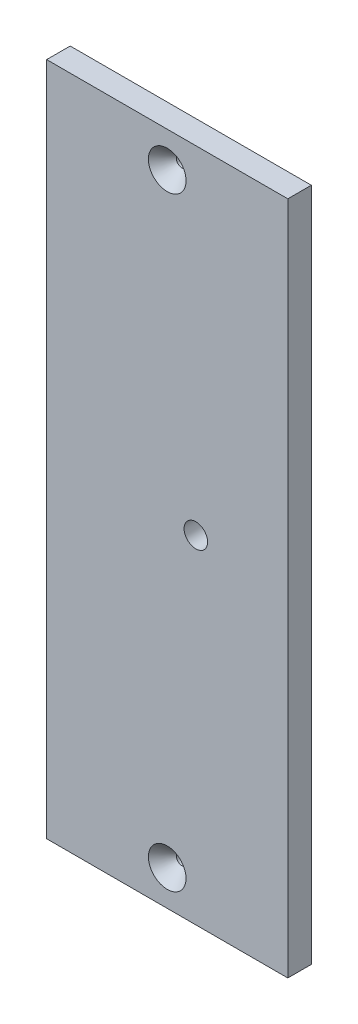
ISO-10303-21;
HEADER;
FILE_DESCRIPTION(('STEP AP214'),'2;1');
FILE_NAME('part.step','',(''),(''),'','','');
FILE_SCHEMA(('AUTOMOTIVE_DESIGN { 1 0 10303 214 1 1 1 1 }'));
ENDSEC;
DATA;
#1=APPLICATION_CONTEXT('core data for automotive mechanical design processes');
#2=APPLICATION_PROTOCOL_DEFINITION('international standard','automotive_design',2000,#1);
#3=PRODUCT_CONTEXT('',#1,'mechanical');
#4=PRODUCT('Part','Part','',(#3));
#5=PRODUCT_RELATED_PRODUCT_CATEGORY('part','',(#4));
#6=PRODUCT_DEFINITION_FORMATION('','',#4);
#7=PRODUCT_DEFINITION_CONTEXT('part definition',#1,'design');
#8=PRODUCT_DEFINITION('design','',#6,#7);
#9=PRODUCT_DEFINITION_SHAPE('','',#8);
#10=(LENGTH_UNIT() NAMED_UNIT(*) SI_UNIT(.MILLI.,.METRE.));
#11=(NAMED_UNIT(*) PLANE_ANGLE_UNIT() SI_UNIT($,.RADIAN.));
#12=(NAMED_UNIT(*) SI_UNIT($,.STERADIAN.) SOLID_ANGLE_UNIT());
#13=UNCERTAINTY_MEASURE_WITH_UNIT(LENGTH_MEASURE(1.E-05),#10,'distance_accuracy_value','');
#14=(GEOMETRIC_REPRESENTATION_CONTEXT(3) GLOBAL_UNCERTAINTY_ASSIGNED_CONTEXT((#13)) GLOBAL_UNIT_ASSIGNED_CONTEXT((#10,
#11,#12)) REPRESENTATION_CONTEXT('',''));
#15=CARTESIAN_POINT('',(0.,0.,0.));
#16=DIRECTION('',(0.,0.,1.));
#17=DIRECTION('',(1.,0.,0.));
#18=AXIS2_PLACEMENT_3D('',#15,#16,#17);
#19=CARTESIAN_POINT('',(-234.752967180658,19.0499999999998,6.35));
#20=DIRECTION('',(0.,-1.,0.));
#21=DIRECTION('',(0.,0.,-1.));
#22=AXIS2_PLACEMENT_3D('',#19,#20,#21);
#23=PLANE('',#22);
#24=DIRECTION('',(-1.,0.,0.));
#25=VECTOR('',#24,1.);
#26=CARTESIAN_POINT('',(-234.752967180658,19.0499999999998,0.));
#27=LINE('',#26,#25);
#28=CARTESIAN_POINT('',(-234.752967180658,19.0499999999998,0.));
#29=VERTEX_POINT('',#28);
#30=CARTESIAN_POINT('',(-299.840829294256,19.0499999999998,0.));
#31=VERTEX_POINT('',#30);
#32=EDGE_CURVE('E113',#29,#31,#27,.T.);
#33=ORIENTED_EDGE('',*,*,#32,.T.);
#34=DIRECTION('',(0.,0.,-1.));
#35=VECTOR('',#34,1.);
#36=CARTESIAN_POINT('',(-299.840829294256,19.0499999999998,6.35));
#37=LINE('',#36,#35);
#38=CARTESIAN_POINT('',(-299.840829294256,19.0499999999998,6.35));
#39=VERTEX_POINT('',#38);
#40=EDGE_CURVE('E11',#39,#31,#37,.T.);
#41=ORIENTED_EDGE('',*,*,#40,.F.);
#42=DIRECTION('',(-1.,0.,0.));
#43=VECTOR('',#42,1.);
#44=CARTESIAN_POINT('',(-234.752967180658,19.0499999999998,6.35));
#45=LINE('',#44,#43);
#46=CARTESIAN_POINT('',(-234.752967180658,19.0499999999998,6.35));
#47=VERTEX_POINT('',#46);
#48=EDGE_CURVE('E96',#47,#39,#45,.T.);
#49=ORIENTED_EDGE('',*,*,#48,.F.);
#50=DIRECTION('',(0.,0.,-1.));
#51=VECTOR('',#50,1.);
#52=CARTESIAN_POINT('',(-234.752967180658,19.0499999999998,6.35));
#53=LINE('',#52,#51);
#54=EDGE_CURVE('E61',#47,#29,#53,.T.);
#55=ORIENTED_EDGE('',*,*,#54,.T.);
#56=EDGE_LOOP('',(#33,#41,#49,#55));
#57=FACE_BOUND('',#56,.T.);
#58=ADVANCED_FACE('F41',(#57),#23,.F.);
#59=CARTESIAN_POINT('',(-299.840829294256,19.0499999999998,6.35));
#60=DIRECTION('',(1.,0.,0.));
#61=DIRECTION('',(0.,0.,-1.));
#62=AXIS2_PLACEMENT_3D('',#59,#60,#61);
#63=PLANE('',#62);
#64=DIRECTION('',(0.,-1.,0.));
#65=VECTOR('',#64,1.);
#66=CARTESIAN_POINT('',(-299.840829294256,19.0499999999998,0.));
#67=LINE('',#66,#65);
#68=CARTESIAN_POINT('',(-299.840829294256,-163.099999994006,0.));
#69=VERTEX_POINT('',#68);
#70=EDGE_CURVE('E102',#31,#69,#67,.T.);
#71=ORIENTED_EDGE('',*,*,#70,.T.);
#72=DIRECTION('',(0.,0.,-1.));
#73=VECTOR('',#72,1.);
#74=CARTESIAN_POINT('',(-299.840829294256,-163.099999994006,6.35));
#75=LINE('',#74,#73);
#76=CARTESIAN_POINT('',(-299.840829294256,-163.099999994006,6.35));
#77=VERTEX_POINT('',#76);
#78=EDGE_CURVE('E50',#77,#69,#75,.T.);
#79=ORIENTED_EDGE('',*,*,#78,.F.);
#80=DIRECTION('',(0.,-1.,0.));
#81=VECTOR('',#80,1.);
#82=CARTESIAN_POINT('',(-299.840829294256,19.0499999999998,6.35));
#83=LINE('',#82,#81);
#84=EDGE_CURVE('E88',#39,#77,#83,.T.);
#85=ORIENTED_EDGE('',*,*,#84,.F.);
#86=ORIENTED_EDGE('',*,*,#40,.T.);
#87=EDGE_LOOP('',(#71,#79,#85,#86));
#88=FACE_BOUND('',#87,.T.);
#89=ADVANCED_FACE('F101',(#88),#63,.F.);
#90=CARTESIAN_POINT('',(-234.752967180658,-163.099999994006,6.35));
#91=DIRECTION('',(0.,-1.,0.));
#92=DIRECTION('',(0.,0.,-1.));
#93=AXIS2_PLACEMENT_3D('',#90,#91,#92);
#94=PLANE('',#93);
#95=DIRECTION('',(-1.,0.,0.));
#96=VECTOR('',#95,1.);
#97=CARTESIAN_POINT('',(-234.752967180658,-163.099999994006,0.));
#98=LINE('',#97,#96);
#99=CARTESIAN_POINT('',(-234.752967180658,-163.099999994006,0.));
#100=VERTEX_POINT('',#99);
#101=EDGE_CURVE('E119',#100,#69,#98,.T.);
#102=ORIENTED_EDGE('',*,*,#101,.F.);
#103=DIRECTION('',(0.,0.,-1.));
#104=VECTOR('',#103,1.);
#105=CARTESIAN_POINT('',(-234.752967180658,-163.099999994006,6.35));
#106=LINE('',#105,#104);
#107=CARTESIAN_POINT('',(-234.752967180658,-163.099999994006,6.35));
#108=VERTEX_POINT('',#107);
#109=EDGE_CURVE('E77',#108,#100,#106,.T.);
#110=ORIENTED_EDGE('',*,*,#109,.F.);
#111=DIRECTION('',(-1.,0.,0.));
#112=VECTOR('',#111,1.);
#113=CARTESIAN_POINT('',(-234.752967180658,-163.099999994006,6.35));
#114=LINE('',#113,#112);
#115=EDGE_CURVE('E95',#108,#77,#114,.T.);
#116=ORIENTED_EDGE('',*,*,#115,.T.);
#117=ORIENTED_EDGE('',*,*,#78,.T.);
#118=EDGE_LOOP('',(#102,#110,#116,#117));
#119=FACE_BOUND('',#118,.T.);
#120=ADVANCED_FACE('F106',(#119),#94,.T.);
#121=CARTESIAN_POINT('',(-234.752967180658,19.0499999999998,6.35));
#122=DIRECTION('',(1.,0.,0.));
#123=DIRECTION('',(0.,1.,0.));
#124=AXIS2_PLACEMENT_3D('',#121,#122,#123);
#125=PLANE('',#124);
#126=DIRECTION('',(0.,-1.,0.));
#127=VECTOR('',#126,1.);
#128=CARTESIAN_POINT('',(-234.752967180658,19.0499999999998,0.));
#129=LINE('',#128,#127);
#130=EDGE_CURVE('E122',#29,#100,#129,.T.);
#131=ORIENTED_EDGE('',*,*,#130,.F.);
#132=ORIENTED_EDGE('',*,*,#54,.F.);
#133=DIRECTION('',(0.,-1.,0.));
#134=VECTOR('',#133,1.);
#135=CARTESIAN_POINT('',(-234.752967180658,19.0499999999998,6.35));
#136=LINE('',#135,#134);
#137=EDGE_CURVE('E107',#47,#108,#136,.T.);
#138=ORIENTED_EDGE('',*,*,#137,.T.);
#139=ORIENTED_EDGE('',*,*,#109,.T.);
#140=EDGE_LOOP('',(#131,#132,#138,#139));
#141=FACE_BOUND('',#140,.T.);
#142=ADVANCED_FACE('F183',(#141),#125,.T.);
#143=CARTESIAN_POINT('',(0.,0.,6.35));
#144=DIRECTION('',(0.,0.,1.));
#145=DIRECTION('',(1.,0.,0.));
#146=AXIS2_PLACEMENT_3D('',#143,#144,#145);
#147=PLANE('',#146);
#148=CARTESIAN_POINT('',(-267.296898237472,9.52499999999873,6.34999999999964));
#149=DIRECTION('',(0.,0.,1.));
#150=DIRECTION('',(1.,0.,0.));
#151=AXIS2_PLACEMENT_3D('',#148,#149,#150);
#152=CIRCLE('',#151,5.07999999999997);
#153=CARTESIAN_POINT('',(-262.216898237472,9.52499999999873,6.34999999999964));
#154=VERTEX_POINT('',#153);
#155=EDGE_CURVE('E151',#154,#154,#152,.T.);
#156=ORIENTED_EDGE('',*,*,#155,.F.);
#157=EDGE_LOOP('',(#156));
#158=FACE_BOUND('',#157,.T.);
#159=CARTESIAN_POINT('',(-267.296898237472,-153.574999994007,6.34999999999964));
#160=DIRECTION('',(0.,0.,1.));
#161=DIRECTION('',(1.,0.,0.));
#162=AXIS2_PLACEMENT_3D('',#159,#160,#161);
#163=CIRCLE('',#162,5.07999999999997);
#164=CARTESIAN_POINT('',(-262.216898237472,-153.574999994007,6.34999999999964));
#165=VERTEX_POINT('',#164);
#166=EDGE_CURVE('E139',#165,#165,#163,.T.);
#167=ORIENTED_EDGE('',*,*,#166,.F.);
#168=EDGE_LOOP('',(#167));
#169=FACE_BOUND('',#168,.T.);
#170=CARTESIAN_POINT('',(-259.576391654624,-72.0249999970018,6.35));
#171=DIRECTION('',(0.,0.,1.));
#172=DIRECTION('',(1.,0.,0.));
#173=AXIS2_PLACEMENT_3D('',#170,#171,#172);
#174=CIRCLE('',#173,3.17499999999998);
#175=CARTESIAN_POINT('',(-256.401391654624,-72.0249999970018,6.35));
#176=VERTEX_POINT('',#175);
#177=EDGE_CURVE('E131',#176,#176,#174,.T.);
#178=ORIENTED_EDGE('',*,*,#177,.F.);
#179=EDGE_LOOP('',(#178));
#180=FACE_BOUND('',#179,.T.);
#181=ORIENTED_EDGE('',*,*,#48,.T.);
#182=ORIENTED_EDGE('',*,*,#84,.T.);
#183=ORIENTED_EDGE('',*,*,#115,.F.);
#184=ORIENTED_EDGE('',*,*,#137,.F.);
#185=EDGE_LOOP('',(#181,#182,#183,#184));
#186=FACE_BOUND('',#185,.T.);
#187=ADVANCED_FACE('F92',(#158,#169,#180,#186),#147,.T.);
#188=CARTESIAN_POINT('',(0.,0.,0.));
#189=DIRECTION('',(0.,0.,1.));
#190=DIRECTION('',(1.,0.,0.));
#191=AXIS2_PLACEMENT_3D('',#188,#189,#190);
#192=PLANE('',#191);
#193=CARTESIAN_POINT('',(-267.296898237472,9.52499999999873,0.));
#194=DIRECTION('',(0.,0.,1.));
#195=DIRECTION('',(1.,0.,0.));
#196=AXIS2_PLACEMENT_3D('',#193,#194,#195);
#197=CIRCLE('',#196,1.58750000000002);
#198=CARTESIAN_POINT('',(-265.709398237472,9.52499999999873,0.));
#199=VERTEX_POINT('',#198);
#200=EDGE_CURVE('E44',#199,#199,#197,.T.);
#201=ORIENTED_EDGE('',*,*,#200,.T.);
#202=EDGE_LOOP('',(#201));
#203=FACE_BOUND('',#202,.T.);
#204=CARTESIAN_POINT('',(-267.296898237472,-153.574999994007,0.));
#205=DIRECTION('',(0.,0.,1.));
#206=DIRECTION('',(1.,0.,0.));
#207=AXIS2_PLACEMENT_3D('',#204,#205,#206);
#208=CIRCLE('',#207,1.58750000000002);
#209=CARTESIAN_POINT('',(-265.709398237472,-153.574999994007,0.));
#210=VERTEX_POINT('',#209);
#211=EDGE_CURVE('E129',#210,#210,#208,.T.);
#212=ORIENTED_EDGE('',*,*,#211,.T.);
#213=EDGE_LOOP('',(#212));
#214=FACE_BOUND('',#213,.T.);
#215=CARTESIAN_POINT('',(-259.576391654624,-72.0249999970018,0.));
#216=DIRECTION('',(0.,0.,1.));
#217=DIRECTION('',(1.,0.,0.));
#218=AXIS2_PLACEMENT_3D('',#215,#216,#217);
#219=CIRCLE('',#218,3.17499999999993);
#220=CARTESIAN_POINT('',(-256.401391654624,-72.0249999970018,0.));
#221=VERTEX_POINT('',#220);
#222=EDGE_CURVE('E116',#221,#221,#219,.T.);
#223=ORIENTED_EDGE('',*,*,#222,.T.);
#224=EDGE_LOOP('',(#223));
#225=FACE_BOUND('',#224,.T.);
#226=ORIENTED_EDGE('',*,*,#32,.F.);
#227=ORIENTED_EDGE('',*,*,#130,.T.);
#228=ORIENTED_EDGE('',*,*,#101,.T.);
#229=ORIENTED_EDGE('',*,*,#70,.F.);
#230=EDGE_LOOP('',(#226,#227,#228,#229));
#231=FACE_BOUND('',#230,.T.);
#232=ADVANCED_FACE('F161',(#203,#214,#225,#231),#192,.F.);
#233=CARTESIAN_POINT('',(-259.576391654624,-72.0249999970018,6.35));
#234=DIRECTION('',(0.,0.,1.));
#235=DIRECTION('',(1.,0.,0.));
#236=AXIS2_PLACEMENT_3D('',#233,#234,#235);
#237=CYLINDRICAL_SURFACE('',#236,3.17499999999996);
#238=ORIENTED_EDGE('',*,*,#222,.F.);
#239=EDGE_LOOP('',(#238));
#240=FACE_BOUND('',#239,.T.);
#241=ORIENTED_EDGE('',*,*,#177,.T.);
#242=EDGE_LOOP('',(#241));
#243=FACE_BOUND('',#242,.T.);
#244=ADVANCED_FACE('F195',(#240,#243),#237,.F.);
#245=CARTESIAN_POINT('',(-267.296898237472,-153.574999994007,6.34999999999963));
#246=DIRECTION('',(0.,0.,1.));
#247=DIRECTION('',(1.,0.,0.));
#248=AXIS2_PLACEMENT_3D('',#245,#246,#247);
#249=CYLINDRICAL_SURFACE('',#248,1.58750000000002);
#250=CARTESIAN_POINT('',(-267.296898237472,-153.574999994007,2.33233833778027));
#251=DIRECTION('',(0.,0.,1.));
#252=DIRECTION('',(1.,0.,0.));
#253=AXIS2_PLACEMENT_3D('',#250,#251,#252);
#254=CIRCLE('',#253,1.58750000000002);
#255=CARTESIAN_POINT('',(-265.709398237472,-153.574999994007,2.33233833778027));
#256=VERTEX_POINT('',#255);
#257=EDGE_CURVE('E132',#256,#256,#254,.T.);
#258=ORIENTED_EDGE('',*,*,#257,.T.);
#259=EDGE_LOOP('',(#258));
#260=FACE_BOUND('',#259,.T.);
#261=ORIENTED_EDGE('',*,*,#211,.F.);
#262=EDGE_LOOP('',(#261));
#263=FACE_BOUND('',#262,.T.);
#264=ADVANCED_FACE('F175',(#260,#263),#249,.F.);
#265=CARTESIAN_POINT('',(-267.296898237472,-153.574999994007,6.34999999999964));
#266=DIRECTION('',(0.,0.,1.));
#267=DIRECTION('',(1.,0.,0.));
#268=AXIS2_PLACEMENT_3D('',#265,#266,#267);
#269=CONICAL_SURFACE('',#268,5.07999999999997,0.71558499331767);
#270=CARTESIAN_POINT('',(-265.709398237472,-153.574999994007,2.33233833778027));
#271=CARTESIAN_POINT('',(-265.673018029139,-153.574999994007,2.37418898009506));
#272=CARTESIAN_POINT('',(-265.636637820806,-153.574999994007,2.41603962240984));
#273=CARTESIAN_POINT('',(-265.563877404139,-153.574999994007,2.49974090703941));
#274=CARTESIAN_POINT('',(-265.527497195806,-153.574999994007,2.5415915493542));
#275=CARTESIAN_POINT('',(-265.454736779139,-153.574999994007,2.62529283398377));
#276=CARTESIAN_POINT('',(-265.418356570806,-153.574999994007,2.66714347629855));
#277=CARTESIAN_POINT('',(-265.345596154139,-153.574999994007,2.75084476092812));
#278=CARTESIAN_POINT('',(-265.309215945806,-153.574999994007,2.79269540324291));
#279=CARTESIAN_POINT('',(-265.236455529139,-153.574999994007,2.87639668787248));
#280=CARTESIAN_POINT('',(-265.200075320806,-153.574999994007,2.91824733018726));
#281=CARTESIAN_POINT('',(-265.127314904139,-153.574999994007,3.00194861481683));
#282=CARTESIAN_POINT('',(-265.090934695806,-153.574999994007,3.04379925713162));
#283=CARTESIAN_POINT('',(-265.018174279139,-153.574999994007,3.12750054176119));
#284=CARTESIAN_POINT('',(-264.981794070806,-153.574999994007,3.16935118407598));
#285=CARTESIAN_POINT('',(-264.909033654139,-153.574999994007,3.25305246870554));
#286=CARTESIAN_POINT('',(-264.872653445806,-153.574999994007,3.29490311102033));
#287=CARTESIAN_POINT('',(-264.799893029139,-153.574999994007,3.3786043956499));
#288=CARTESIAN_POINT('',(-264.763512820806,-153.574999994007,3.42045503796468));
#289=CARTESIAN_POINT('',(-264.690752404139,-153.574999994007,3.50415632259425));
#290=CARTESIAN_POINT('',(-264.654372195806,-153.574999994007,3.54600696490904));
#291=CARTESIAN_POINT('',(-264.581611779139,-153.574999994007,3.62970824953861));
#292=CARTESIAN_POINT('',(-264.545231570806,-153.574999994007,3.67155889185339));
#293=CARTESIAN_POINT('',(-264.472471154139,-153.574999994007,3.75526017648296));
#294=CARTESIAN_POINT('',(-264.436090945806,-153.574999994007,3.79711081879775));
#295=CARTESIAN_POINT('',(-264.363330529139,-153.574999994007,3.88081210342732));
#296=CARTESIAN_POINT('',(-264.326950320806,-153.574999994007,3.9226627457421));
#297=CARTESIAN_POINT('',(-264.254189904139,-153.574999994007,4.00636403037167));
#298=CARTESIAN_POINT('',(-264.217809695806,-153.574999994007,4.04821467268646));
#299=CARTESIAN_POINT('',(-264.145049279139,-153.574999994007,4.13191595731603));
#300=CARTESIAN_POINT('',(-264.108669070806,-153.574999994007,4.17376659963082));
#301=CARTESIAN_POINT('',(-264.035908654139,-153.574999994007,4.25746788426038));
#302=CARTESIAN_POINT('',(-263.999528445806,-153.574999994007,4.29931852657516));
#303=CARTESIAN_POINT('',(-263.926768029139,-153.574999994007,4.38301981120474));
#304=CARTESIAN_POINT('',(-263.890387820806,-153.574999994007,4.42487045351953));
#305=CARTESIAN_POINT('',(-263.817627404139,-153.574999994007,4.5085717381491));
#306=CARTESIAN_POINT('',(-263.781247195806,-153.574999994007,4.55042238046388));
#307=CARTESIAN_POINT('',(-263.708486779139,-153.574999994007,4.63412366509345));
#308=CARTESIAN_POINT('',(-263.672106570806,-153.574999994007,4.67597430740823));
#309=CARTESIAN_POINT('',(-263.599346154139,-153.574999994007,4.75967559203781));
#310=CARTESIAN_POINT('',(-263.562965945806,-153.574999994007,4.80152623435259));
#311=CARTESIAN_POINT('',(-263.490205529139,-153.574999994007,4.88522751898216));
#312=CARTESIAN_POINT('',(-263.453825320806,-153.574999994007,4.92707816129695));
#313=CARTESIAN_POINT('',(-263.381064904139,-153.574999994007,5.01077944592652));
#314=CARTESIAN_POINT('',(-263.344684695806,-153.574999994007,5.0526300882413));
#315=CARTESIAN_POINT('',(-263.271924279139,-153.574999994007,5.13633137287087));
#316=CARTESIAN_POINT('',(-263.235544070806,-153.574999994007,5.17818201518566));
#317=CARTESIAN_POINT('',(-263.162783654139,-153.574999994007,5.26188329981523));
#318=CARTESIAN_POINT('',(-263.126403445806,-153.574999994007,5.30373394213001));
#319=CARTESIAN_POINT('',(-263.053643029139,-153.574999994007,5.38743522675958));
#320=CARTESIAN_POINT('',(-263.017262820806,-153.574999994007,5.42928586907437));
#321=CARTESIAN_POINT('',(-262.944502404139,-153.574999994007,5.51298715370393));
#322=CARTESIAN_POINT('',(-262.908122195806,-153.574999994007,5.55483779601871));
#323=CARTESIAN_POINT('',(-262.835361779139,-153.574999994007,5.63853908064829));
#324=CARTESIAN_POINT('',(-262.798981570806,-153.574999994007,5.68038972296308));
#325=CARTESIAN_POINT('',(-262.726221154139,-153.574999994007,5.76409100759265));
#326=CARTESIAN_POINT('',(-262.689840945806,-153.574999994007,5.80594164990743));
#327=CARTESIAN_POINT('',(-262.617080529139,-153.574999994007,5.889642934537));
#328=CARTESIAN_POINT('',(-262.580700320806,-153.574999994007,5.93149357685179));
#329=CARTESIAN_POINT('',(-262.507939904139,-153.574999994007,6.01519486148136));
#330=CARTESIAN_POINT('',(-262.471559695806,-153.574999994007,6.05704550379614));
#331=CARTESIAN_POINT('',(-262.398799279139,-153.574999994007,6.14074678842571));
#332=CARTESIAN_POINT('',(-262.362419070806,-153.574999994007,6.1825974307405));
#333=CARTESIAN_POINT('',(-262.289658654139,-153.574999994007,6.26629871537007));
#334=CARTESIAN_POINT('',(-262.253278445806,-153.574999994007,6.30814935768485));
#335=CARTESIAN_POINT('',(-262.216898237472,-153.574999994007,6.34999999999964));
#336=B_SPLINE_CURVE_WITH_KNOTS('',3,(#270,#271,#272,#273,#274,#275,#276,#277,#278,#279,#280,
#281,#282,#283,#284,#285,#286,#287,#288,#289,#290,#291,#292,#293,#294,#295,#296,#297,#298,#299,
#300,#301,#302,#303,#304,#305,#306,#307,#308,#309,#310,#311,#312,#313,#314,#315,#316,#317,#318,
#319,#320,#321,#322,#323,#324,#325,#326,#327,#328,#329,#330,#331,#332,#333,#334,#335),
.UNSPECIFIED.,.F.,.F.,(4,2,2,2,2,2,2,2,2,2,2,2,2,2,2,2,2,2,2,2,2,2,2,2,2,2,2,2,2,2,2,2,4),(0.,
0.166357934541254,0.332715869082508,0.499073803623762,0.665431738165016,0.83178967270627,
0.998147607247487,1.16450554178874,1.33086347632999,1.49722141087125,1.6635793454125,
1.82993727995376,1.99629521449501,2.16265314903626,2.32901108357752,2.49536901811877,
2.66172695266003,2.82808488720124,2.9944428217425,3.16080075628375,3.327158690825,
3.49351662536626,3.65987455990751,3.82623249444877,3.99259042899002,4.15894836353127,
4.32530629807253,4.49166423261375,4.658022167155,4.82438010169625,4.99073803623751,
5.15709597077876,5.32345390532002),.UNSPECIFIED.);
#337=EDGE_CURVE('BSEAM166',#256,#165,#336,.T.);
#338=ORIENTED_EDGE('',*,*,#257,.F.);
#339=ORIENTED_EDGE('',*,*,#166,.T.);
#340=ORIENTED_EDGE('',*,*,#337,.T.);
#341=ORIENTED_EDGE('',*,*,#337,.F.);
#342=EDGE_LOOP('',(#338,#340,#339,#341));
#343=FACE_BOUND('',#342,.T.);
#344=ADVANCED_FACE('F166',(#343),#269,.F.);
#345=CARTESIAN_POINT('',(-267.296898237472,9.52499999999873,6.34999999999963));
#346=DIRECTION('',(0.,0.,1.));
#347=DIRECTION('',(1.,0.,0.));
#348=AXIS2_PLACEMENT_3D('',#345,#346,#347);
#349=CYLINDRICAL_SURFACE('',#348,1.58750000000002);
#350=CARTESIAN_POINT('',(-267.296898237472,9.52499999999873,2.33233833778027));
#351=DIRECTION('',(0.,0.,1.));
#352=DIRECTION('',(1.,0.,0.));
#353=AXIS2_PLACEMENT_3D('',#350,#351,#352);
#354=CIRCLE('',#353,1.58750000000002);
#355=CARTESIAN_POINT('',(-265.709398237472,9.52499999999873,2.33233833778027));
#356=VERTEX_POINT('',#355);
#357=EDGE_CURVE('E154',#356,#356,#354,.T.);
#358=ORIENTED_EDGE('',*,*,#357,.T.);
#359=EDGE_LOOP('',(#358));
#360=FACE_BOUND('',#359,.T.);
#361=ORIENTED_EDGE('',*,*,#200,.F.);
#362=EDGE_LOOP('',(#361));
#363=FACE_BOUND('',#362,.T.);
#364=ADVANCED_FACE('F163',(#360,#363),#349,.F.);
#365=CARTESIAN_POINT('',(-267.296898237472,9.52499999999873,6.34999999999964));
#366=DIRECTION('',(0.,0.,1.));
#367=DIRECTION('',(1.,0.,0.));
#368=AXIS2_PLACEMENT_3D('',#365,#366,#367);
#369=CONICAL_SURFACE('',#368,5.07999999999997,0.71558499331767);
#370=CARTESIAN_POINT('',(-265.709398237472,9.52499999999873,2.33233833778027));
#371=CARTESIAN_POINT('',(-265.673018029139,9.52499999999873,2.37418898009506));
#372=CARTESIAN_POINT('',(-265.636637820806,9.52499999999873,2.41603962240984));
#373=CARTESIAN_POINT('',(-265.563877404139,9.52499999999873,2.49974090703941));
#374=CARTESIAN_POINT('',(-265.527497195806,9.52499999999873,2.5415915493542));
#375=CARTESIAN_POINT('',(-265.454736779139,9.52499999999873,2.62529283398377));
#376=CARTESIAN_POINT('',(-265.418356570806,9.52499999999873,2.66714347629855));
#377=CARTESIAN_POINT('',(-265.345596154139,9.52499999999873,2.75084476092812));
#378=CARTESIAN_POINT('',(-265.309215945806,9.52499999999873,2.79269540324291));
#379=CARTESIAN_POINT('',(-265.236455529139,9.52499999999873,2.87639668787248));
#380=CARTESIAN_POINT('',(-265.200075320806,9.52499999999873,2.91824733018726));
#381=CARTESIAN_POINT('',(-265.127314904139,9.52499999999873,3.00194861481683));
#382=CARTESIAN_POINT('',(-265.090934695806,9.52499999999873,3.04379925713162));
#383=CARTESIAN_POINT('',(-265.018174279139,9.52499999999873,3.12750054176119));
#384=CARTESIAN_POINT('',(-264.981794070806,9.52499999999873,3.16935118407598));
#385=CARTESIAN_POINT('',(-264.909033654139,9.52499999999873,3.25305246870554));
#386=CARTESIAN_POINT('',(-264.872653445806,9.52499999999873,3.29490311102033));
#387=CARTESIAN_POINT('',(-264.799893029139,9.52499999999873,3.3786043956499));
#388=CARTESIAN_POINT('',(-264.763512820806,9.52499999999873,3.42045503796468));
#389=CARTESIAN_POINT('',(-264.690752404139,9.52499999999873,3.50415632259425));
#390=CARTESIAN_POINT('',(-264.654372195806,9.52499999999873,3.54600696490904));
#391=CARTESIAN_POINT('',(-264.581611779139,9.52499999999873,3.62970824953861));
#392=CARTESIAN_POINT('',(-264.545231570806,9.52499999999873,3.67155889185339));
#393=CARTESIAN_POINT('',(-264.472471154139,9.52499999999873,3.75526017648296));
#394=CARTESIAN_POINT('',(-264.436090945806,9.52499999999873,3.79711081879775));
#395=CARTESIAN_POINT('',(-264.363330529139,9.52499999999873,3.88081210342732));
#396=CARTESIAN_POINT('',(-264.326950320806,9.52499999999873,3.9226627457421));
#397=CARTESIAN_POINT('',(-264.254189904139,9.52499999999873,4.00636403037167));
#398=CARTESIAN_POINT('',(-264.217809695806,9.52499999999873,4.04821467268646));
#399=CARTESIAN_POINT('',(-264.145049279139,9.52499999999873,4.13191595731603));
#400=CARTESIAN_POINT('',(-264.108669070806,9.52499999999873,4.17376659963082));
#401=CARTESIAN_POINT('',(-264.035908654139,9.52499999999873,4.25746788426038));
#402=CARTESIAN_POINT('',(-263.999528445806,9.52499999999873,4.29931852657516));
#403=CARTESIAN_POINT('',(-263.926768029139,9.52499999999873,4.38301981120474));
#404=CARTESIAN_POINT('',(-263.890387820806,9.52499999999873,4.42487045351953));
#405=CARTESIAN_POINT('',(-263.817627404139,9.52499999999873,4.5085717381491));
#406=CARTESIAN_POINT('',(-263.781247195806,9.52499999999873,4.55042238046388));
#407=CARTESIAN_POINT('',(-263.708486779139,9.52499999999873,4.63412366509345));
#408=CARTESIAN_POINT('',(-263.672106570806,9.52499999999873,4.67597430740823));
#409=CARTESIAN_POINT('',(-263.599346154139,9.52499999999873,4.75967559203781));
#410=CARTESIAN_POINT('',(-263.562965945806,9.52499999999873,4.80152623435259));
#411=CARTESIAN_POINT('',(-263.490205529139,9.52499999999873,4.88522751898216));
#412=CARTESIAN_POINT('',(-263.453825320806,9.52499999999873,4.92707816129695));
#413=CARTESIAN_POINT('',(-263.381064904139,9.52499999999873,5.01077944592652));
#414=CARTESIAN_POINT('',(-263.344684695806,9.52499999999873,5.0526300882413));
#415=CARTESIAN_POINT('',(-263.271924279139,9.52499999999873,5.13633137287087));
#416=CARTESIAN_POINT('',(-263.235544070806,9.52499999999873,5.17818201518566));
#417=CARTESIAN_POINT('',(-263.162783654139,9.52499999999873,5.26188329981523));
#418=CARTESIAN_POINT('',(-263.126403445806,9.52499999999873,5.30373394213001));
#419=CARTESIAN_POINT('',(-263.053643029139,9.52499999999873,5.38743522675958));
#420=CARTESIAN_POINT('',(-263.017262820806,9.52499999999873,5.42928586907437));
#421=CARTESIAN_POINT('',(-262.944502404139,9.52499999999873,5.51298715370393));
#422=CARTESIAN_POINT('',(-262.908122195806,9.52499999999873,5.55483779601871));
#423=CARTESIAN_POINT('',(-262.835361779139,9.52499999999873,5.63853908064829));
#424=CARTESIAN_POINT('',(-262.798981570806,9.52499999999873,5.68038972296308));
#425=CARTESIAN_POINT('',(-262.726221154139,9.52499999999873,5.76409100759265));
#426=CARTESIAN_POINT('',(-262.689840945806,9.52499999999873,5.80594164990743));
#427=CARTESIAN_POINT('',(-262.617080529139,9.52499999999873,5.889642934537));
#428=CARTESIAN_POINT('',(-262.580700320806,9.52499999999873,5.93149357685179));
#429=CARTESIAN_POINT('',(-262.507939904139,9.52499999999873,6.01519486148136));
#430=CARTESIAN_POINT('',(-262.471559695806,9.52499999999873,6.05704550379614));
#431=CARTESIAN_POINT('',(-262.398799279139,9.52499999999873,6.14074678842571));
#432=CARTESIAN_POINT('',(-262.362419070806,9.52499999999873,6.1825974307405));
#433=CARTESIAN_POINT('',(-262.289658654139,9.52499999999873,6.26629871537007));
#434=CARTESIAN_POINT('',(-262.253278445806,9.52499999999873,6.30814935768485));
#435=CARTESIAN_POINT('',(-262.216898237472,9.52499999999873,6.34999999999964));
#436=B_SPLINE_CURVE_WITH_KNOTS('',3,(#370,#371,#372,#373,#374,#375,#376,#377,#378,#379,#380,
#381,#382,#383,#384,#385,#386,#387,#388,#389,#390,#391,#392,#393,#394,#395,#396,#397,#398,#399,
#400,#401,#402,#403,#404,#405,#406,#407,#408,#409,#410,#411,#412,#413,#414,#415,#416,#417,#418,
#419,#420,#421,#422,#423,#424,#425,#426,#427,#428,#429,#430,#431,#432,#433,#434,#435),
.UNSPECIFIED.,.F.,.F.,(4,2,2,2,2,2,2,2,2,2,2,2,2,2,2,2,2,2,2,2,2,2,2,2,2,2,2,2,2,2,2,2,4),(0.,
0.166357934541254,0.332715869082508,0.499073803623762,0.665431738165016,0.83178967270627,
0.998147607247487,1.16450554178874,1.33086347632999,1.49722141087125,1.6635793454125,
1.82993727995376,1.99629521449501,2.16265314903626,2.32901108357752,2.49536901811877,
2.66172695266003,2.82808488720124,2.9944428217425,3.16080075628375,3.327158690825,
3.49351662536626,3.65987455990751,3.82623249444877,3.99259042899002,4.15894836353127,
4.32530629807253,4.49166423261375,4.658022167155,4.82438010169625,4.99073803623751,
5.15709597077876,5.32345390532002),.UNSPECIFIED.);
#437=EDGE_CURVE('BSEAM165',#356,#154,#436,.T.);
#438=ORIENTED_EDGE('',*,*,#357,.F.);
#439=ORIENTED_EDGE('',*,*,#155,.T.);
#440=ORIENTED_EDGE('',*,*,#437,.T.);
#441=ORIENTED_EDGE('',*,*,#437,.F.);
#442=EDGE_LOOP('',(#438,#440,#439,#441));
#443=FACE_BOUND('',#442,.T.);
#444=ADVANCED_FACE('F165',(#443),#369,.F.);
#445=CLOSED_SHELL('',(#58,#89,#120,#142,#187,#232,#244,#264,#344,#364,#444));
#446=MANIFOLD_SOLID_BREP('B2',#445);
#447=ADVANCED_BREP_SHAPE_REPRESENTATION('',(#18,#446),#14);
#448=SHAPE_DEFINITION_REPRESENTATION(#9,#447);
ENDSEC;
END-ISO-10303-21;
